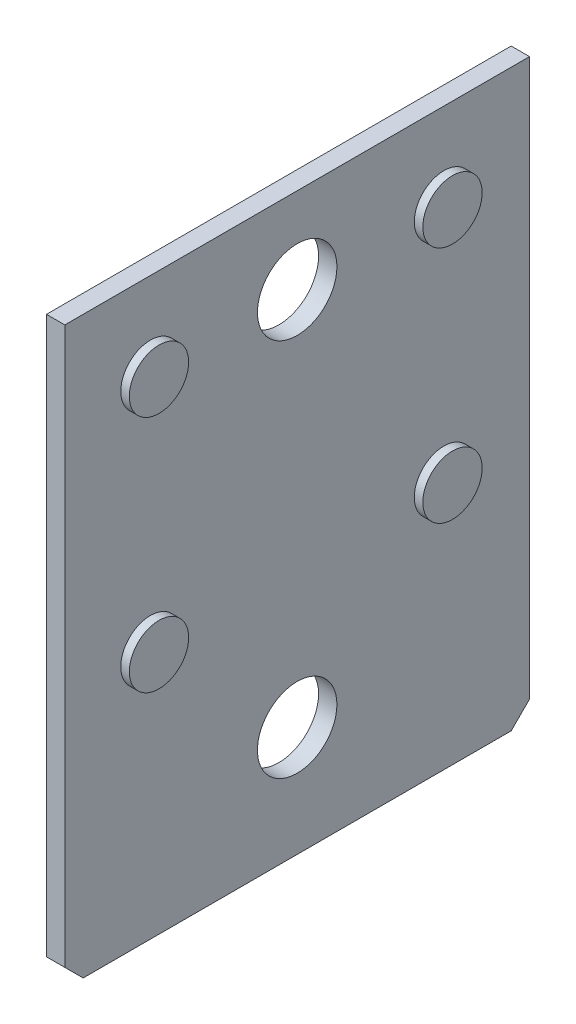
ISO-10303-21;
HEADER;
FILE_DESCRIPTION(('STEP AP214'),'2;1');
FILE_NAME('part.step','',(''),(''),'','','');
FILE_SCHEMA(('AUTOMOTIVE_DESIGN { 1 0 10303 214 1 1 1 1 }'));
ENDSEC;
DATA;
#1=APPLICATION_CONTEXT('core data for automotive mechanical design processes');
#2=APPLICATION_PROTOCOL_DEFINITION('international standard','automotive_design',2000,#1);
#3=PRODUCT_CONTEXT('',#1,'mechanical');
#4=PRODUCT('Part','Part','',(#3));
#5=PRODUCT_RELATED_PRODUCT_CATEGORY('part','',(#4));
#6=PRODUCT_DEFINITION_FORMATION('','',#4);
#7=PRODUCT_DEFINITION_CONTEXT('part definition',#1,'design');
#8=PRODUCT_DEFINITION('design','',#6,#7);
#9=PRODUCT_DEFINITION_SHAPE('','',#8);
#10=(LENGTH_UNIT() NAMED_UNIT(*) SI_UNIT(.MILLI.,.METRE.));
#11=(NAMED_UNIT(*) PLANE_ANGLE_UNIT() SI_UNIT($,.RADIAN.));
#12=(NAMED_UNIT(*) SI_UNIT($,.STERADIAN.) SOLID_ANGLE_UNIT());
#13=UNCERTAINTY_MEASURE_WITH_UNIT(LENGTH_MEASURE(1.E-05),#10,'distance_accuracy_value','');
#14=(GEOMETRIC_REPRESENTATION_CONTEXT(3) GLOBAL_UNCERTAINTY_ASSIGNED_CONTEXT((#13)) GLOBAL_UNIT_ASSIGNED_CONTEXT((#10,
#11,#12)) REPRESENTATION_CONTEXT('',''));
#15=CARTESIAN_POINT('',(0.,0.,0.));
#16=DIRECTION('',(0.,0.,1.));
#17=DIRECTION('',(1.,0.,0.));
#18=AXIS2_PLACEMENT_3D('',#15,#16,#17);
#19=CARTESIAN_POINT('',(1.5,0.,0.));
#20=DIRECTION('',(-1.,0.,0.));
#21=DIRECTION('',(0.,0.,1.));
#22=AXIS2_PLACEMENT_3D('',#19,#20,#21);
#23=PLANE('',#22);
#24=CARTESIAN_POINT('',(1.5,20.5,12.));
#25=DIRECTION('',(-1.,0.,0.));
#26=DIRECTION('',(0.,0.,1.));
#27=AXIS2_PLACEMENT_3D('',#24,#25,#26);
#28=CIRCLE('',#27,2.425);
#29=CARTESIAN_POINT('',(1.5,20.5,14.425));
#30=VERTEX_POINT('',#29);
#31=EDGE_CURVE('E130',#30,#30,#28,.F.);
#32=ORIENTED_EDGE('',*,*,#31,.F.);
#33=EDGE_LOOP('',(#32));
#34=FACE_BOUND('',#33,.T.);
#35=CARTESIAN_POINT('',(1.5,40.,12.));
#36=DIRECTION('',(-1.,0.,0.));
#37=DIRECTION('',(0.,0.,1.));
#38=AXIS2_PLACEMENT_3D('',#35,#36,#37);
#39=CIRCLE('',#38,2.425);
#40=CARTESIAN_POINT('',(1.5,40.,14.425));
#41=VERTEX_POINT('',#40);
#42=EDGE_CURVE('E107',#41,#41,#39,.F.);
#43=ORIENTED_EDGE('',*,*,#42,.F.);
#44=EDGE_LOOP('',(#43));
#45=FACE_BOUND('',#44,.T.);
#46=CARTESIAN_POINT('',(1.5,40.,0.));
#47=DIRECTION('',(1.,0.,0.));
#48=DIRECTION('',(0.,0.,-1.));
#49=AXIS2_PLACEMENT_3D('',#46,#47,#48);
#50=CIRCLE('',#49,3.25);
#51=CARTESIAN_POINT('',(1.5,40.,-3.25));
#52=VERTEX_POINT('',#51);
#53=EDGE_CURVE('E164',#52,#52,#50,.T.);
#54=ORIENTED_EDGE('',*,*,#53,.F.);
#55=EDGE_LOOP('',(#54));
#56=FACE_BOUND('',#55,.T.);
#57=CARTESIAN_POINT('',(1.5,9.,0.));
#58=DIRECTION('',(1.,0.,0.));
#59=DIRECTION('',(0.,0.,-1.));
#60=AXIS2_PLACEMENT_3D('',#57,#58,#59);
#61=CIRCLE('',#60,3.25);
#62=CARTESIAN_POINT('',(1.5,9.,-3.25));
#63=VERTEX_POINT('',#62);
#64=EDGE_CURVE('E158',#63,#63,#61,.T.);
#65=ORIENTED_EDGE('',*,*,#64,.F.);
#66=EDGE_LOOP('',(#65));
#67=FACE_BOUND('',#66,.T.);
#68=DIRECTION('',(0.,0.,-1.));
#69=VECTOR('',#68,1.);
#70=CARTESIAN_POINT('',(1.5,0.,19.));
#71=LINE('',#70,#69);
#72=CARTESIAN_POINT('',(1.5,0.,17.5));
#73=VERTEX_POINT('',#72);
#74=CARTESIAN_POINT('',(1.5,0.,-17.5));
#75=VERTEX_POINT('',#74);
#76=EDGE_CURVE('E98',#73,#75,#71,.T.);
#77=ORIENTED_EDGE('',*,*,#76,.T.);
#78=DIRECTION('',(0.,-0.707106781186548,0.707106781186548));
#79=VECTOR('',#78,1.);
#80=CARTESIAN_POINT('',(1.5,1.50000000000002,-19.));
#81=LINE('',#80,#79);
#82=CARTESIAN_POINT('',(1.5,1.50000000000001,-19.));
#83=VERTEX_POINT('',#82);
#84=EDGE_CURVE('E42',#75,#83,#81,.F.);
#85=ORIENTED_EDGE('',*,*,#84,.T.);
#86=DIRECTION('',(0.,1.,0.));
#87=VECTOR('',#86,1.);
#88=CARTESIAN_POINT('',(1.5,0.,-19.));
#89=LINE('',#88,#87);
#90=CARTESIAN_POINT('',(1.5,47.,-19.));
#91=VERTEX_POINT('',#90);
#92=EDGE_CURVE('E88',#83,#91,#89,.T.);
#93=ORIENTED_EDGE('',*,*,#92,.T.);
#94=DIRECTION('',(0.,0.,1.));
#95=VECTOR('',#94,1.);
#96=CARTESIAN_POINT('',(1.5,47.,19.));
#97=LINE('',#96,#95);
#98=CARTESIAN_POINT('',(1.5,47.,19.));
#99=VERTEX_POINT('',#98);
#100=EDGE_CURVE('E92',#91,#99,#97,.T.);
#101=ORIENTED_EDGE('',*,*,#100,.T.);
#102=DIRECTION('',(0.,-1.,0.));
#103=VECTOR('',#102,1.);
#104=CARTESIAN_POINT('',(1.5,0.,19.));
#105=LINE('',#104,#103);
#106=CARTESIAN_POINT('',(1.5,1.50000000000002,19.));
#107=VERTEX_POINT('',#106);
#108=EDGE_CURVE('E123',#99,#107,#105,.T.);
#109=ORIENTED_EDGE('',*,*,#108,.T.);
#110=DIRECTION('',(0.,0.707106781186548,0.707106781186548));
#111=VECTOR('',#110,1.);
#112=CARTESIAN_POINT('',(1.5,0.,17.5));
#113=LINE('',#112,#111);
#114=EDGE_CURVE('E146',#107,#73,#113,.F.);
#115=ORIENTED_EDGE('',*,*,#114,.T.);
#116=EDGE_LOOP('',(#77,#85,#93,#101,#109,#115));
#117=FACE_BOUND('',#116,.T.);
#118=CARTESIAN_POINT('',(1.5,40.,-12.));
#119=DIRECTION('',(-1.,0.,0.));
#120=DIRECTION('',(0.,0.,1.));
#121=AXIS2_PLACEMENT_3D('',#118,#119,#120);
#122=CIRCLE('',#121,2.425);
#123=CARTESIAN_POINT('',(1.5,40.,-9.575));
#124=VERTEX_POINT('',#123);
#125=EDGE_CURVE('E127',#124,#124,#122,.F.);
#126=ORIENTED_EDGE('',*,*,#125,.F.);
#127=EDGE_LOOP('',(#126));
#128=FACE_BOUND('',#127,.T.);
#129=CARTESIAN_POINT('',(1.5,20.5,-12.));
#130=DIRECTION('',(-1.,0.,0.));
#131=DIRECTION('',(0.,0.,1.));
#132=AXIS2_PLACEMENT_3D('',#129,#130,#131);
#133=CIRCLE('',#132,2.425);
#134=CARTESIAN_POINT('',(1.5,20.5,-9.575));
#135=VERTEX_POINT('',#134);
#136=EDGE_CURVE('E133',#135,#135,#133,.F.);
#137=ORIENTED_EDGE('',*,*,#136,.F.);
#138=EDGE_LOOP('',(#137));
#139=FACE_BOUND('',#138,.T.);
#140=ADVANCED_FACE('F34',(#34,#45,#56,#67,#117,#128,#139),#23,.F.);
#141=CARTESIAN_POINT('',(1.5,0.,19.));
#142=DIRECTION('',(0.,0.,-1.));
#143=DIRECTION('',(-1.,0.,0.));
#144=AXIS2_PLACEMENT_3D('',#141,#142,#143);
#145=PLANE('',#144);
#146=DIRECTION('',(0.,-1.,0.));
#147=VECTOR('',#146,1.);
#148=CARTESIAN_POINT('',(0.,0.,19.));
#149=LINE('',#148,#147);
#150=CARTESIAN_POINT('',(0.,47.,19.));
#151=VERTEX_POINT('',#150);
#152=CARTESIAN_POINT('',(0.,1.50000000000002,19.));
#153=VERTEX_POINT('',#152);
#154=EDGE_CURVE('E116',#151,#153,#149,.T.);
#155=ORIENTED_EDGE('',*,*,#154,.T.);
#156=DIRECTION('',(1.,0.,0.));
#157=VECTOR('',#156,1.);
#158=CARTESIAN_POINT('',(1.5,1.50000000000002,19.));
#159=LINE('',#158,#157);
#160=EDGE_CURVE('E11',#153,#107,#159,.T.);
#161=ORIENTED_EDGE('',*,*,#160,.T.);
#162=ORIENTED_EDGE('',*,*,#108,.F.);
#163=DIRECTION('',(-1.,0.,0.));
#164=VECTOR('',#163,1.);
#165=CARTESIAN_POINT('',(1.5,47.,19.));
#166=LINE('',#165,#164);
#167=EDGE_CURVE('E108',#99,#151,#166,.T.);
#168=ORIENTED_EDGE('',*,*,#167,.T.);
#169=EDGE_LOOP('',(#155,#161,#162,#168));
#170=FACE_BOUND('',#169,.T.);
#171=ADVANCED_FACE('F155',(#170),#145,.F.);
#172=CARTESIAN_POINT('',(1.5,0.,19.));
#173=DIRECTION('',(0.,1.,0.));
#174=DIRECTION('',(0.,0.,1.));
#175=AXIS2_PLACEMENT_3D('',#172,#173,#174);
#176=PLANE('',#175);
#177=DIRECTION('',(0.,0.,-1.));
#178=VECTOR('',#177,1.);
#179=CARTESIAN_POINT('',(0.,0.,19.));
#180=LINE('',#179,#178);
#181=CARTESIAN_POINT('',(0.,0.,17.5));
#182=VERTEX_POINT('',#181);
#183=CARTESIAN_POINT('',(0.,0.,-17.5));
#184=VERTEX_POINT('',#183);
#185=EDGE_CURVE('E118',#182,#184,#180,.T.);
#186=ORIENTED_EDGE('',*,*,#185,.T.);
#187=DIRECTION('',(1.,0.,0.));
#188=VECTOR('',#187,1.);
#189=CARTESIAN_POINT('',(1.5,0.,-17.5));
#190=LINE('',#189,#188);
#191=EDGE_CURVE('E55',#184,#75,#190,.T.);
#192=ORIENTED_EDGE('',*,*,#191,.T.);
#193=ORIENTED_EDGE('',*,*,#76,.F.);
#194=DIRECTION('',(-1.,0.,0.));
#195=VECTOR('',#194,1.);
#196=CARTESIAN_POINT('',(1.5,0.,17.5));
#197=LINE('',#196,#195);
#198=EDGE_CURVE('E142',#73,#182,#197,.T.);
#199=ORIENTED_EDGE('',*,*,#198,.T.);
#200=EDGE_LOOP('',(#186,#192,#193,#199));
#201=FACE_BOUND('',#200,.T.);
#202=ADVANCED_FACE('F150',(#201),#176,.F.);
#203=CARTESIAN_POINT('',(1.5,0.,-19.));
#204=DIRECTION('',(0.,0.,1.));
#205=DIRECTION('',(1.,0.,0.));
#206=AXIS2_PLACEMENT_3D('',#203,#204,#205);
#207=PLANE('',#206);
#208=ORIENTED_EDGE('',*,*,#92,.F.);
#209=DIRECTION('',(-1.,0.,0.));
#210=VECTOR('',#209,1.);
#211=CARTESIAN_POINT('',(1.5,1.50000000000002,-19.));
#212=LINE('',#211,#210);
#213=CARTESIAN_POINT('',(0.,1.50000000000002,-19.));
#214=VERTEX_POINT('',#213);
#215=EDGE_CURVE('E136',#83,#214,#212,.T.);
#216=ORIENTED_EDGE('',*,*,#215,.T.);
#217=DIRECTION('',(0.,1.,0.));
#218=VECTOR('',#217,1.);
#219=CARTESIAN_POINT('',(0.,0.,-19.));
#220=LINE('',#219,#218);
#221=CARTESIAN_POINT('',(0.,47.,-19.));
#222=VERTEX_POINT('',#221);
#223=EDGE_CURVE('E104',#214,#222,#220,.T.);
#224=ORIENTED_EDGE('',*,*,#223,.T.);
#225=DIRECTION('',(-1.,0.,0.));
#226=VECTOR('',#225,1.);
#227=CARTESIAN_POINT('',(1.5,47.,-19.));
#228=LINE('',#227,#226);
#229=EDGE_CURVE('E101',#91,#222,#228,.T.);
#230=ORIENTED_EDGE('',*,*,#229,.F.);
#231=EDGE_LOOP('',(#208,#216,#224,#230));
#232=FACE_BOUND('',#231,.T.);
#233=ADVANCED_FACE('F102',(#232),#207,.F.);
#234=CARTESIAN_POINT('',(1.5,47.,19.));
#235=DIRECTION('',(0.,-1.,0.));
#236=DIRECTION('',(0.,0.,-1.));
#237=AXIS2_PLACEMENT_3D('',#234,#235,#236);
#238=PLANE('',#237);
#239=DIRECTION('',(0.,0.,1.));
#240=VECTOR('',#239,1.);
#241=CARTESIAN_POINT('',(0.,47.,19.));
#242=LINE('',#241,#240);
#243=EDGE_CURVE('E122',#222,#151,#242,.T.);
#244=ORIENTED_EDGE('',*,*,#243,.T.);
#245=ORIENTED_EDGE('',*,*,#167,.F.);
#246=ORIENTED_EDGE('',*,*,#100,.F.);
#247=ORIENTED_EDGE('',*,*,#229,.T.);
#248=EDGE_LOOP('',(#244,#245,#246,#247));
#249=FACE_BOUND('',#248,.T.);
#250=ADVANCED_FACE('F110',(#249),#238,.F.);
#251=CARTESIAN_POINT('',(0.,0.,0.));
#252=DIRECTION('',(-1.,0.,0.));
#253=DIRECTION('',(0.,0.,1.));
#254=AXIS2_PLACEMENT_3D('',#251,#252,#253);
#255=PLANE('',#254);
#256=CARTESIAN_POINT('',(0.,20.5,12.));
#257=DIRECTION('',(-1.,0.,0.));
#258=DIRECTION('',(0.,0.,1.));
#259=AXIS2_PLACEMENT_3D('',#256,#257,#258);
#260=CIRCLE('',#259,2.425);
#261=CARTESIAN_POINT('',(0.,20.5,14.425));
#262=VERTEX_POINT('',#261);
#263=EDGE_CURVE('E188',#262,#262,#260,.T.);
#264=ORIENTED_EDGE('',*,*,#263,.F.);
#265=EDGE_LOOP('',(#264));
#266=FACE_BOUND('',#265,.T.);
#267=CARTESIAN_POINT('',(0.,20.5,-12.));
#268=DIRECTION('',(-1.,0.,0.));
#269=DIRECTION('',(0.,0.,1.));
#270=AXIS2_PLACEMENT_3D('',#267,#268,#269);
#271=CIRCLE('',#270,2.425);
#272=CARTESIAN_POINT('',(0.,20.5,-9.575));
#273=VERTEX_POINT('',#272);
#274=EDGE_CURVE('E182',#273,#273,#271,.T.);
#275=ORIENTED_EDGE('',*,*,#274,.F.);
#276=EDGE_LOOP('',(#275));
#277=FACE_BOUND('',#276,.T.);
#278=CARTESIAN_POINT('',(0.,40.,12.));
#279=DIRECTION('',(-1.,0.,0.));
#280=DIRECTION('',(0.,0.,1.));
#281=AXIS2_PLACEMENT_3D('',#278,#279,#280);
#282=CIRCLE('',#281,2.425);
#283=CARTESIAN_POINT('',(0.,40.,14.425));
#284=VERTEX_POINT('',#283);
#285=EDGE_CURVE('E176',#284,#284,#282,.T.);
#286=ORIENTED_EDGE('',*,*,#285,.F.);
#287=EDGE_LOOP('',(#286));
#288=FACE_BOUND('',#287,.T.);
#289=CARTESIAN_POINT('',(0.,40.,-12.));
#290=DIRECTION('',(-1.,0.,0.));
#291=DIRECTION('',(0.,0.,1.));
#292=AXIS2_PLACEMENT_3D('',#289,#290,#291);
#293=CIRCLE('',#292,2.425);
#294=CARTESIAN_POINT('',(0.,40.,-9.575));
#295=VERTEX_POINT('',#294);
#296=EDGE_CURVE('E170',#295,#295,#293,.T.);
#297=ORIENTED_EDGE('',*,*,#296,.F.);
#298=EDGE_LOOP('',(#297));
#299=FACE_BOUND('',#298,.T.);
#300=CARTESIAN_POINT('',(0.,40.,0.));
#301=DIRECTION('',(1.,0.,0.));
#302=DIRECTION('',(0.,0.,-1.));
#303=AXIS2_PLACEMENT_3D('',#300,#301,#302);
#304=CIRCLE('',#303,3.25);
#305=CARTESIAN_POINT('',(0.,40.,-3.25));
#306=VERTEX_POINT('',#305);
#307=EDGE_CURVE('E161',#306,#306,#304,.T.);
#308=ORIENTED_EDGE('',*,*,#307,.T.);
#309=EDGE_LOOP('',(#308));
#310=FACE_BOUND('',#309,.T.);
#311=CARTESIAN_POINT('',(0.,9.,0.));
#312=DIRECTION('',(1.,0.,0.));
#313=DIRECTION('',(0.,0.,-1.));
#314=AXIS2_PLACEMENT_3D('',#311,#312,#313);
#315=CIRCLE('',#314,3.25);
#316=CARTESIAN_POINT('',(0.,9.,-3.25));
#317=VERTEX_POINT('',#316);
#318=EDGE_CURVE('E119',#317,#317,#315,.T.);
#319=ORIENTED_EDGE('',*,*,#318,.T.);
#320=EDGE_LOOP('',(#319));
#321=FACE_BOUND('',#320,.T.);
#322=ORIENTED_EDGE('',*,*,#223,.F.);
#323=DIRECTION('',(0.,0.707106781186548,-0.707106781186548));
#324=VECTOR('',#323,1.);
#325=CARTESIAN_POINT('',(0.,-8.74999999999999,-8.74999999999999));
#326=LINE('',#325,#324);
#327=EDGE_CURVE('E140',#214,#184,#326,.F.);
#328=ORIENTED_EDGE('',*,*,#327,.T.);
#329=ORIENTED_EDGE('',*,*,#185,.F.);
#330=DIRECTION('',(0.,-0.707106781186548,-0.707106781186548));
#331=VECTOR('',#330,1.);
#332=CARTESIAN_POINT('',(0.,-8.74999999999999,8.74999999999999));
#333=LINE('',#332,#331);
#334=EDGE_CURVE('E138',#182,#153,#333,.F.);
#335=ORIENTED_EDGE('',*,*,#334,.T.);
#336=ORIENTED_EDGE('',*,*,#154,.F.);
#337=ORIENTED_EDGE('',*,*,#243,.F.);
#338=EDGE_LOOP('',(#322,#328,#329,#335,#336,#337));
#339=FACE_BOUND('',#338,.T.);
#340=ADVANCED_FACE('F154',(#266,#277,#288,#299,#310,#321,#339),#255,.T.);
#341=CARTESIAN_POINT('',(0.,9.,0.));
#342=DIRECTION('',(1.,0.,0.));
#343=DIRECTION('',(0.,0.,-1.));
#344=AXIS2_PLACEMENT_3D('',#341,#342,#343);
#345=CYLINDRICAL_SURFACE('',#344,3.25);
#346=ORIENTED_EDGE('',*,*,#318,.F.);
#347=EDGE_LOOP('',(#346));
#348=FACE_BOUND('',#347,.T.);
#349=ORIENTED_EDGE('',*,*,#64,.T.);
#350=EDGE_LOOP('',(#349));
#351=FACE_BOUND('',#350,.T.);
#352=ADVANCED_FACE('F226',(#348,#351),#345,.F.);
#353=CARTESIAN_POINT('',(0.,40.,0.));
#354=DIRECTION('',(1.,0.,0.));
#355=DIRECTION('',(0.,0.,-1.));
#356=AXIS2_PLACEMENT_3D('',#353,#354,#355);
#357=CYLINDRICAL_SURFACE('',#356,3.25);
#358=ORIENTED_EDGE('',*,*,#307,.F.);
#359=EDGE_LOOP('',(#358));
#360=FACE_BOUND('',#359,.T.);
#361=ORIENTED_EDGE('',*,*,#53,.T.);
#362=EDGE_LOOP('',(#361));
#363=FACE_BOUND('',#362,.T.);
#364=ADVANCED_FACE('F300',(#360,#363),#357,.F.);
#365=CARTESIAN_POINT('',(0.7,40.,-12.));
#366=DIRECTION('',(-1.,0.,0.));
#367=DIRECTION('',(0.,0.,1.));
#368=AXIS2_PLACEMENT_3D('',#365,#366,#367);
#369=CYLINDRICAL_SURFACE('',#368,2.425);
#370=CARTESIAN_POINT('',(0.7,40.,-12.));
#371=DIRECTION('',(-1.,0.,0.));
#372=DIRECTION('',(0.,0.,1.));
#373=AXIS2_PLACEMENT_3D('',#370,#371,#372);
#374=CIRCLE('',#373,2.425);
#375=CARTESIAN_POINT('',(0.7,40.,-9.575));
#376=VERTEX_POINT('',#375);
#377=EDGE_CURVE('E167',#376,#376,#374,.T.);
#378=ORIENTED_EDGE('',*,*,#377,.F.);
#379=EDGE_LOOP('',(#378));
#380=FACE_BOUND('',#379,.T.);
#381=ORIENTED_EDGE('',*,*,#296,.T.);
#382=EDGE_LOOP('',(#381));
#383=FACE_BOUND('',#382,.T.);
#384=ADVANCED_FACE('F297',(#380,#383),#369,.F.);
#385=CARTESIAN_POINT('',(0.7,40.,-12.));
#386=DIRECTION('',(-1.,0.,0.));
#387=DIRECTION('',(0.,0.,1.));
#388=AXIS2_PLACEMENT_3D('',#385,#386,#387);
#389=PLANE('',#388);
#390=ORIENTED_EDGE('',*,*,#377,.T.);
#391=EDGE_LOOP('',(#390));
#392=FACE_BOUND('',#391,.T.);
#393=ADVANCED_FACE('F293',(#392),#389,.T.);
#394=CARTESIAN_POINT('',(0.7,40.,12.));
#395=DIRECTION('',(-1.,0.,0.));
#396=DIRECTION('',(0.,0.,1.));
#397=AXIS2_PLACEMENT_3D('',#394,#395,#396);
#398=CYLINDRICAL_SURFACE('',#397,2.425);
#399=CARTESIAN_POINT('',(0.7,40.,12.));
#400=DIRECTION('',(-1.,0.,0.));
#401=DIRECTION('',(0.,0.,1.));
#402=AXIS2_PLACEMENT_3D('',#399,#400,#401);
#403=CIRCLE('',#402,2.425);
#404=CARTESIAN_POINT('',(0.7,40.,14.425));
#405=VERTEX_POINT('',#404);
#406=EDGE_CURVE('E173',#405,#405,#403,.T.);
#407=ORIENTED_EDGE('',*,*,#406,.F.);
#408=EDGE_LOOP('',(#407));
#409=FACE_BOUND('',#408,.T.);
#410=ORIENTED_EDGE('',*,*,#285,.T.);
#411=EDGE_LOOP('',(#410));
#412=FACE_BOUND('',#411,.T.);
#413=ADVANCED_FACE('F289',(#409,#412),#398,.F.);
#414=CARTESIAN_POINT('',(0.7,40.,12.));
#415=DIRECTION('',(-1.,0.,0.));
#416=DIRECTION('',(0.,0.,1.));
#417=AXIS2_PLACEMENT_3D('',#414,#415,#416);
#418=PLANE('',#417);
#419=ORIENTED_EDGE('',*,*,#406,.T.);
#420=EDGE_LOOP('',(#419));
#421=FACE_BOUND('',#420,.T.);
#422=ADVANCED_FACE('F285',(#421),#418,.T.);
#423=CARTESIAN_POINT('',(0.7,20.5,-12.));
#424=DIRECTION('',(-1.,0.,0.));
#425=DIRECTION('',(0.,0.,1.));
#426=AXIS2_PLACEMENT_3D('',#423,#424,#425);
#427=CYLINDRICAL_SURFACE('',#426,2.425);
#428=CARTESIAN_POINT('',(0.7,20.5,-12.));
#429=DIRECTION('',(-1.,0.,0.));
#430=DIRECTION('',(0.,0.,1.));
#431=AXIS2_PLACEMENT_3D('',#428,#429,#430);
#432=CIRCLE('',#431,2.425);
#433=CARTESIAN_POINT('',(0.7,20.5,-9.575));
#434=VERTEX_POINT('',#433);
#435=EDGE_CURVE('E179',#434,#434,#432,.T.);
#436=ORIENTED_EDGE('',*,*,#435,.F.);
#437=EDGE_LOOP('',(#436));
#438=FACE_BOUND('',#437,.T.);
#439=ORIENTED_EDGE('',*,*,#274,.T.);
#440=EDGE_LOOP('',(#439));
#441=FACE_BOUND('',#440,.T.);
#442=ADVANCED_FACE('F281',(#438,#441),#427,.F.);
#443=CARTESIAN_POINT('',(0.7,20.5,-12.));
#444=DIRECTION('',(-1.,0.,0.));
#445=DIRECTION('',(0.,0.,1.));
#446=AXIS2_PLACEMENT_3D('',#443,#444,#445);
#447=PLANE('',#446);
#448=ORIENTED_EDGE('',*,*,#435,.T.);
#449=EDGE_LOOP('',(#448));
#450=FACE_BOUND('',#449,.T.);
#451=ADVANCED_FACE('F277',(#450),#447,.T.);
#452=CARTESIAN_POINT('',(0.7,20.5,12.));
#453=DIRECTION('',(-1.,0.,0.));
#454=DIRECTION('',(0.,0.,1.));
#455=AXIS2_PLACEMENT_3D('',#452,#453,#454);
#456=CYLINDRICAL_SURFACE('',#455,2.425);
#457=CARTESIAN_POINT('',(0.7,20.5,12.));
#458=DIRECTION('',(-1.,0.,0.));
#459=DIRECTION('',(0.,0.,1.));
#460=AXIS2_PLACEMENT_3D('',#457,#458,#459);
#461=CIRCLE('',#460,2.425);
#462=CARTESIAN_POINT('',(0.7,20.5,14.425));
#463=VERTEX_POINT('',#462);
#464=EDGE_CURVE('E185',#463,#463,#461,.T.);
#465=ORIENTED_EDGE('',*,*,#464,.F.);
#466=EDGE_LOOP('',(#465));
#467=FACE_BOUND('',#466,.T.);
#468=ORIENTED_EDGE('',*,*,#263,.T.);
#469=EDGE_LOOP('',(#468));
#470=FACE_BOUND('',#469,.T.);
#471=ADVANCED_FACE('F273',(#467,#470),#456,.F.);
#472=CARTESIAN_POINT('',(0.7,20.5,12.));
#473=DIRECTION('',(-1.,0.,0.));
#474=DIRECTION('',(0.,0.,1.));
#475=AXIS2_PLACEMENT_3D('',#472,#473,#474);
#476=PLANE('',#475);
#477=ORIENTED_EDGE('',*,*,#464,.T.);
#478=EDGE_LOOP('',(#477));
#479=FACE_BOUND('',#478,.T.);
#480=ADVANCED_FACE('F269',(#479),#476,.T.);
#481=CARTESIAN_POINT('',(2.2,40.,12.));
#482=DIRECTION('',(-1.,0.,0.));
#483=DIRECTION('',(0.,0.,1.));
#484=AXIS2_PLACEMENT_3D('',#481,#482,#483);
#485=CYLINDRICAL_SURFACE('',#484,2.425);
#486=CARTESIAN_POINT('',(2.2,40.,12.));
#487=DIRECTION('',(1.,0.,0.));
#488=DIRECTION('',(0.,0.,-1.));
#489=AXIS2_PLACEMENT_3D('',#486,#487,#488);
#490=CIRCLE('',#489,2.425);
#491=CARTESIAN_POINT('',(2.2,40.,9.575));
#492=VERTEX_POINT('',#491);
#493=EDGE_CURVE('E191',#492,#492,#490,.T.);
#494=ORIENTED_EDGE('',*,*,#493,.F.);
#495=EDGE_LOOP('',(#494));
#496=FACE_BOUND('',#495,.T.);
#497=ORIENTED_EDGE('',*,*,#42,.T.);
#498=EDGE_LOOP('',(#497));
#499=FACE_BOUND('',#498,.T.);
#500=ADVANCED_FACE('F265',(#496,#499),#485,.T.);
#501=CARTESIAN_POINT('',(2.2,40.,12.));
#502=DIRECTION('',(1.,0.,0.));
#503=DIRECTION('',(0.,0.,-1.));
#504=AXIS2_PLACEMENT_3D('',#501,#502,#503);
#505=PLANE('',#504);
#506=ORIENTED_EDGE('',*,*,#493,.T.);
#507=EDGE_LOOP('',(#506));
#508=FACE_BOUND('',#507,.T.);
#509=ADVANCED_FACE('F261',(#508),#505,.T.);
#510=CARTESIAN_POINT('',(2.2,40.,-12.));
#511=DIRECTION('',(-1.,0.,0.));
#512=DIRECTION('',(0.,0.,1.));
#513=AXIS2_PLACEMENT_3D('',#510,#511,#512);
#514=CYLINDRICAL_SURFACE('',#513,2.425);
#515=CARTESIAN_POINT('',(2.2,40.,-12.));
#516=DIRECTION('',(1.,0.,0.));
#517=DIRECTION('',(0.,0.,-1.));
#518=AXIS2_PLACEMENT_3D('',#515,#516,#517);
#519=CIRCLE('',#518,2.425);
#520=CARTESIAN_POINT('',(2.2,40.,-14.425));
#521=VERTEX_POINT('',#520);
#522=EDGE_CURVE('E196',#521,#521,#519,.T.);
#523=ORIENTED_EDGE('',*,*,#522,.F.);
#524=EDGE_LOOP('',(#523));
#525=FACE_BOUND('',#524,.T.);
#526=ORIENTED_EDGE('',*,*,#125,.T.);
#527=EDGE_LOOP('',(#526));
#528=FACE_BOUND('',#527,.T.);
#529=ADVANCED_FACE('F257',(#525,#528),#514,.T.);
#530=CARTESIAN_POINT('',(2.2,40.,-12.));
#531=DIRECTION('',(1.,0.,0.));
#532=DIRECTION('',(0.,0.,-1.));
#533=AXIS2_PLACEMENT_3D('',#530,#531,#532);
#534=PLANE('',#533);
#535=ORIENTED_EDGE('',*,*,#522,.T.);
#536=EDGE_LOOP('',(#535));
#537=FACE_BOUND('',#536,.T.);
#538=ADVANCED_FACE('F253',(#537),#534,.T.);
#539=CARTESIAN_POINT('',(2.2,20.5,12.));
#540=DIRECTION('',(-1.,0.,0.));
#541=DIRECTION('',(0.,0.,1.));
#542=AXIS2_PLACEMENT_3D('',#539,#540,#541);
#543=CYLINDRICAL_SURFACE('',#542,2.425);
#544=CARTESIAN_POINT('',(2.2,20.5,12.));
#545=DIRECTION('',(1.,0.,0.));
#546=DIRECTION('',(0.,0.,-1.));
#547=AXIS2_PLACEMENT_3D('',#544,#545,#546);
#548=CIRCLE('',#547,2.425);
#549=CARTESIAN_POINT('',(2.2,20.5,9.575));
#550=VERTEX_POINT('',#549);
#551=EDGE_CURVE('E199',#550,#550,#548,.T.);
#552=ORIENTED_EDGE('',*,*,#551,.F.);
#553=EDGE_LOOP('',(#552));
#554=FACE_BOUND('',#553,.T.);
#555=ORIENTED_EDGE('',*,*,#31,.T.);
#556=EDGE_LOOP('',(#555));
#557=FACE_BOUND('',#556,.T.);
#558=ADVANCED_FACE('F249',(#554,#557),#543,.T.);
#559=CARTESIAN_POINT('',(2.2,20.5,12.));
#560=DIRECTION('',(1.,0.,0.));
#561=DIRECTION('',(0.,0.,-1.));
#562=AXIS2_PLACEMENT_3D('',#559,#560,#561);
#563=PLANE('',#562);
#564=ORIENTED_EDGE('',*,*,#551,.T.);
#565=EDGE_LOOP('',(#564));
#566=FACE_BOUND('',#565,.T.);
#567=ADVANCED_FACE('F211',(#566),#563,.T.);
#568=CARTESIAN_POINT('',(2.2,20.5,-12.));
#569=DIRECTION('',(-1.,0.,0.));
#570=DIRECTION('',(0.,0.,1.));
#571=AXIS2_PLACEMENT_3D('',#568,#569,#570);
#572=CYLINDRICAL_SURFACE('',#571,2.425);
#573=CARTESIAN_POINT('',(2.2,20.5,-12.));
#574=DIRECTION('',(1.,0.,0.));
#575=DIRECTION('',(0.,0.,-1.));
#576=AXIS2_PLACEMENT_3D('',#573,#574,#575);
#577=CIRCLE('',#576,2.425);
#578=CARTESIAN_POINT('',(2.2,20.5,-14.425));
#579=VERTEX_POINT('',#578);
#580=EDGE_CURVE('E202',#579,#579,#577,.T.);
#581=ORIENTED_EDGE('',*,*,#580,.F.);
#582=EDGE_LOOP('',(#581));
#583=FACE_BOUND('',#582,.T.);
#584=ORIENTED_EDGE('',*,*,#136,.T.);
#585=EDGE_LOOP('',(#584));
#586=FACE_BOUND('',#585,.T.);
#587=ADVANCED_FACE('F208',(#583,#586),#572,.T.);
#588=CARTESIAN_POINT('',(2.2,20.5,-12.));
#589=DIRECTION('',(1.,0.,0.));
#590=DIRECTION('',(0.,0.,-1.));
#591=AXIS2_PLACEMENT_3D('',#588,#589,#590);
#592=PLANE('',#591);
#593=ORIENTED_EDGE('',*,*,#580,.T.);
#594=EDGE_LOOP('',(#593));
#595=FACE_BOUND('',#594,.T.);
#596=ADVANCED_FACE('F206',(#595),#592,.T.);
#597=CARTESIAN_POINT('',(1.5,1.50000000000002,-19.));
#598=DIRECTION('',(0.,0.707106781186547,0.707106781186547));
#599=DIRECTION('',(-1.,0.,0.));
#600=AXIS2_PLACEMENT_3D('',#597,#598,#599);
#601=PLANE('',#600);
#602=ORIENTED_EDGE('',*,*,#84,.F.);
#603=ORIENTED_EDGE('',*,*,#191,.F.);
#604=ORIENTED_EDGE('',*,*,#327,.F.);
#605=ORIENTED_EDGE('',*,*,#215,.F.);
#606=EDGE_LOOP('',(#602,#603,#604,#605));
#607=FACE_BOUND('',#606,.T.);
#608=ADVANCED_FACE('F236',(#607),#601,.F.);
#609=CARTESIAN_POINT('',(1.5,0.,17.5));
#610=DIRECTION('',(0.,0.707106781186547,-0.707106781186547));
#611=DIRECTION('',(-1.,0.,0.));
#612=AXIS2_PLACEMENT_3D('',#609,#610,#611);
#613=PLANE('',#612);
#614=ORIENTED_EDGE('',*,*,#114,.F.);
#615=ORIENTED_EDGE('',*,*,#160,.F.);
#616=ORIENTED_EDGE('',*,*,#334,.F.);
#617=ORIENTED_EDGE('',*,*,#198,.F.);
#618=EDGE_LOOP('',(#614,#615,#616,#617));
#619=FACE_BOUND('',#618,.T.);
#620=ADVANCED_FACE('F36',(#619),#613,.F.);
#621=CLOSED_SHELL('',(#140,#171,#202,#233,#250,#340,#352,#364,#384,#393,#413,#422,#442,#451,
#471,#480,#500,#509,#529,#538,#558,#567,#587,#596,#608,#620));
#622=MANIFOLD_SOLID_BREP('B2',#621);
#623=ADVANCED_BREP_SHAPE_REPRESENTATION('',(#18,#622),#14);
#624=SHAPE_DEFINITION_REPRESENTATION(#9,#623);
ENDSEC;
END-ISO-10303-21;
